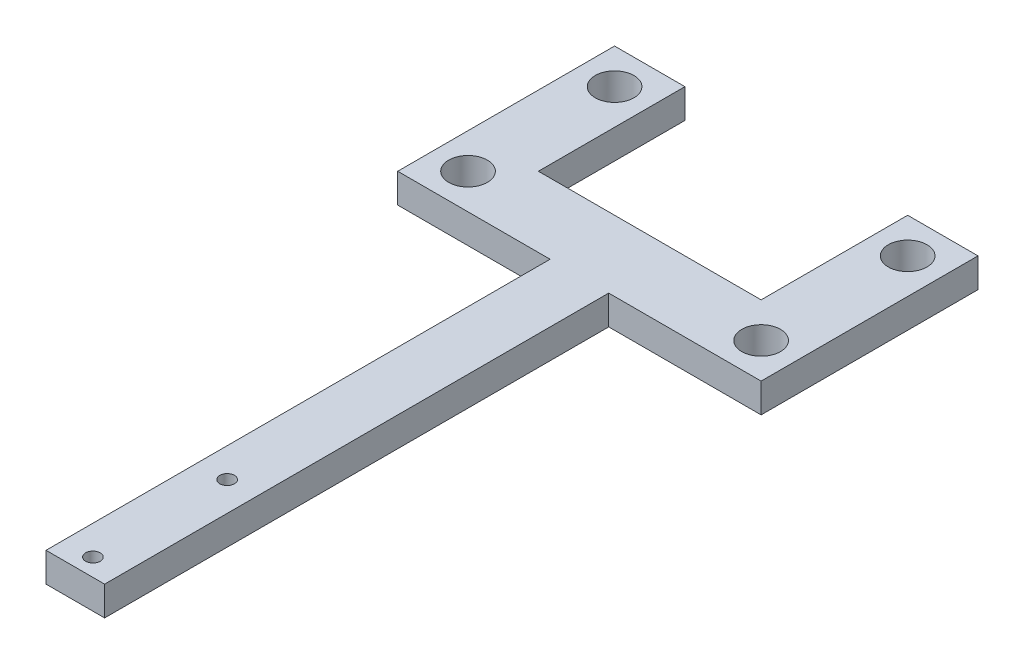
ISO-10303-21;
HEADER;
FILE_DESCRIPTION(('STEP AP214'),'2;1');
FILE_NAME('part.step','',(''),(''),'','','');
FILE_SCHEMA(('AUTOMOTIVE_DESIGN { 1 0 10303 214 1 1 1 1 }'));
ENDSEC;
DATA;
#1=APPLICATION_CONTEXT('core data for automotive mechanical design processes');
#2=APPLICATION_PROTOCOL_DEFINITION('international standard','automotive_design',2000,#1);
#3=PRODUCT_CONTEXT('',#1,'mechanical');
#4=PRODUCT('Part','Part','',(#3));
#5=PRODUCT_RELATED_PRODUCT_CATEGORY('part','',(#4));
#6=PRODUCT_DEFINITION_FORMATION('','',#4);
#7=PRODUCT_DEFINITION_CONTEXT('part definition',#1,'design');
#8=PRODUCT_DEFINITION('design','',#6,#7);
#9=PRODUCT_DEFINITION_SHAPE('','',#8);
#10=(LENGTH_UNIT() NAMED_UNIT(*) SI_UNIT(.MILLI.,.METRE.));
#11=(NAMED_UNIT(*) PLANE_ANGLE_UNIT() SI_UNIT($,.RADIAN.));
#12=(NAMED_UNIT(*) SI_UNIT($,.STERADIAN.) SOLID_ANGLE_UNIT());
#13=UNCERTAINTY_MEASURE_WITH_UNIT(LENGTH_MEASURE(1.E-05),#10,'distance_accuracy_value','');
#14=(GEOMETRIC_REPRESENTATION_CONTEXT(3) GLOBAL_UNCERTAINTY_ASSIGNED_CONTEXT((#13)) GLOBAL_UNIT_ASSIGNED_CONTEXT((#10,
#11,#12)) REPRESENTATION_CONTEXT('',''));
#15=CARTESIAN_POINT('',(0.,0.,0.));
#16=DIRECTION('',(0.,0.,1.));
#17=DIRECTION('',(1.,0.,0.));
#18=AXIS2_PLACEMENT_3D('',#15,#16,#17);
#19=CARTESIAN_POINT('',(-31.,5.,61.5));
#20=DIRECTION('',(0.,0.,-1.));
#21=DIRECTION('',(-1.,0.,0.));
#22=AXIS2_PLACEMENT_3D('',#19,#20,#21);
#23=PLANE('',#22);
#24=DIRECTION('',(1.,0.,0.));
#25=VECTOR('',#24,1.);
#26=CARTESIAN_POINT('',(-31.,0.,61.5));
#27=LINE('',#26,#25);
#28=CARTESIAN_POINT('',(-5.00000000000001,0.,61.5));
#29=VERTEX_POINT('',#28);
#30=CARTESIAN_POINT('',(4.99999999999999,0.,61.5));
#31=VERTEX_POINT('',#30);
#32=EDGE_CURVE('E189',#29,#31,#27,.T.);
#33=ORIENTED_EDGE('',*,*,#32,.T.);
#34=DIRECTION('',(0.,-1.,0.));
#35=VECTOR('',#34,1.);
#36=CARTESIAN_POINT('',(4.99999999999999,0.,61.5));
#37=LINE('',#36,#35);
#38=CARTESIAN_POINT('',(4.99999999999999,5.,61.5));
#39=VERTEX_POINT('',#38);
#40=EDGE_CURVE('E48',#39,#31,#37,.T.);
#41=ORIENTED_EDGE('',*,*,#40,.F.);
#42=DIRECTION('',(1.,0.,0.));
#43=VECTOR('',#42,1.);
#44=CARTESIAN_POINT('',(-31.,5.,61.5));
#45=LINE('',#44,#43);
#46=CARTESIAN_POINT('',(-5.00000000000001,5.,61.5));
#47=VERTEX_POINT('',#46);
#48=EDGE_CURVE('E196',#47,#39,#45,.T.);
#49=ORIENTED_EDGE('',*,*,#48,.F.);
#50=DIRECTION('',(0.,1.,0.));
#51=VECTOR('',#50,1.);
#52=CARTESIAN_POINT('',(-5.00000000000001,0.,61.5));
#53=LINE('',#52,#51);
#54=EDGE_CURVE('E148',#29,#47,#53,.T.);
#55=ORIENTED_EDGE('',*,*,#54,.F.);
#56=EDGE_LOOP('',(#33,#41,#49,#55));
#57=FACE_BOUND('',#56,.T.);
#58=ADVANCED_FACE('F31',(#57),#23,.F.);
#59=CARTESIAN_POINT('',(-31.,5.,-61.5));
#60=DIRECTION('',(0.,0.,1.));
#61=DIRECTION('',(1.,0.,0.));
#62=AXIS2_PLACEMENT_3D('',#59,#60,#61);
#63=PLANE('',#62);
#64=DIRECTION('',(-1.,0.,0.));
#65=VECTOR('',#64,1.);
#66=CARTESIAN_POINT('',(-31.,0.,-61.5));
#67=LINE('',#66,#65);
#68=CARTESIAN_POINT('',(31.,0.,-61.5));
#69=VERTEX_POINT('',#68);
#70=CARTESIAN_POINT('',(19.,0.,-61.5));
#71=VERTEX_POINT('',#70);
#72=EDGE_CURVE('E201',#69,#71,#67,.T.);
#73=ORIENTED_EDGE('',*,*,#72,.T.);
#74=DIRECTION('',(0.,-1.,0.));
#75=VECTOR('',#74,1.);
#76=CARTESIAN_POINT('',(19.,5.,-61.5));
#77=LINE('',#76,#75);
#78=CARTESIAN_POINT('',(19.,5.,-61.5));
#79=VERTEX_POINT('',#78);
#80=EDGE_CURVE('E160',#79,#71,#77,.T.);
#81=ORIENTED_EDGE('',*,*,#80,.F.);
#82=DIRECTION('',(-1.,0.,0.));
#83=VECTOR('',#82,1.);
#84=CARTESIAN_POINT('',(-31.,5.,-61.5));
#85=LINE('',#84,#83);
#86=CARTESIAN_POINT('',(31.,5.,-61.5));
#87=VERTEX_POINT('',#86);
#88=EDGE_CURVE('E190',#87,#79,#85,.T.);
#89=ORIENTED_EDGE('',*,*,#88,.F.);
#90=DIRECTION('',(0.,-1.,0.));
#91=VECTOR('',#90,1.);
#92=CARTESIAN_POINT('',(31.,5.,-61.5));
#93=LINE('',#92,#91);
#94=EDGE_CURVE('E11',#87,#69,#93,.T.);
#95=ORIENTED_EDGE('',*,*,#94,.T.);
#96=EDGE_LOOP('',(#73,#81,#89,#95));
#97=FACE_BOUND('',#96,.T.);
#98=ADVANCED_FACE('F243',(#97),#63,.F.);
#99=CARTESIAN_POINT('',(31.,5.,61.5));
#100=DIRECTION('',(-1.,0.,0.));
#101=DIRECTION('',(0.,0.,1.));
#102=AXIS2_PLACEMENT_3D('',#99,#100,#101);
#103=PLANE('',#102);
#104=DIRECTION('',(0.,0.,-1.));
#105=VECTOR('',#104,1.);
#106=CARTESIAN_POINT('',(31.,5.,61.5));
#107=LINE('',#106,#105);
#108=CARTESIAN_POINT('',(31.,5.,-24.5));
#109=VERTEX_POINT('',#108);
#110=EDGE_CURVE('E186',#109,#87,#107,.T.);
#111=ORIENTED_EDGE('',*,*,#110,.F.);
#112=DIRECTION('',(0.,1.,0.));
#113=VECTOR('',#112,1.);
#114=CARTESIAN_POINT('',(31.,0.,-24.5));
#115=LINE('',#114,#113);
#116=CARTESIAN_POINT('',(31.,0.,-24.5));
#117=VERTEX_POINT('',#116);
#118=EDGE_CURVE('E213',#117,#109,#115,.T.);
#119=ORIENTED_EDGE('',*,*,#118,.F.);
#120=DIRECTION('',(0.,0.,-1.));
#121=VECTOR('',#120,1.);
#122=CARTESIAN_POINT('',(31.,0.,61.5));
#123=LINE('',#122,#121);
#124=EDGE_CURVE('E141',#117,#69,#123,.T.);
#125=ORIENTED_EDGE('',*,*,#124,.T.);
#126=ORIENTED_EDGE('',*,*,#94,.F.);
#127=EDGE_LOOP('',(#111,#119,#125,#126));
#128=FACE_BOUND('',#127,.T.);
#129=ADVANCED_FACE('F33',(#128),#103,.F.);
#130=CARTESIAN_POINT('',(-19.,5.,-61.5));
#131=VERTEX_POINT('',#130);
#132=CARTESIAN_POINT('',(-31.,5.,-61.5));
#133=VERTEX_POINT('',#132);
#134=EDGE_CURVE('E188',#131,#133,#85,.T.);
#135=ORIENTED_EDGE('',*,*,#134,.F.);
#136=DIRECTION('',(0.,1.,0.));
#137=VECTOR('',#136,1.);
#138=CARTESIAN_POINT('',(-19.,5.,-61.5));
#139=LINE('',#138,#137);
#140=CARTESIAN_POINT('',(-19.,0.,-61.5));
#141=VERTEX_POINT('',#140);
#142=EDGE_CURVE('E165',#141,#131,#139,.T.);
#143=ORIENTED_EDGE('',*,*,#142,.F.);
#144=CARTESIAN_POINT('',(-31.,0.,-61.5));
#145=VERTEX_POINT('',#144);
#146=EDGE_CURVE('E200',#141,#145,#67,.T.);
#147=ORIENTED_EDGE('',*,*,#146,.T.);
#148=DIRECTION('',(0.,-1.,0.));
#149=VECTOR('',#148,1.);
#150=CARTESIAN_POINT('',(-31.,5.,-61.5));
#151=LINE('',#150,#149);
#152=EDGE_CURVE('E40',#133,#145,#151,.T.);
#153=ORIENTED_EDGE('',*,*,#152,.F.);
#154=EDGE_LOOP('',(#135,#143,#147,#153));
#155=FACE_BOUND('',#154,.T.);
#156=ADVANCED_FACE('F260',(#155),#63,.F.);
#157=CARTESIAN_POINT('',(-31.,5.,61.5));
#158=DIRECTION('',(1.,0.,0.));
#159=DIRECTION('',(0.,0.,-1.));
#160=AXIS2_PLACEMENT_3D('',#157,#158,#159);
#161=PLANE('',#160);
#162=DIRECTION('',(0.,0.,1.));
#163=VECTOR('',#162,1.);
#164=CARTESIAN_POINT('',(-31.,0.,61.5));
#165=LINE('',#164,#163);
#166=CARTESIAN_POINT('',(-31.,0.,-24.5));
#167=VERTEX_POINT('',#166);
#168=EDGE_CURVE('E204',#145,#167,#165,.T.);
#169=ORIENTED_EDGE('',*,*,#168,.T.);
#170=DIRECTION('',(0.,-1.,0.));
#171=VECTOR('',#170,1.);
#172=CARTESIAN_POINT('',(-31.,0.,-24.5));
#173=LINE('',#172,#171);
#174=CARTESIAN_POINT('',(-31.,5.,-24.5));
#175=VERTEX_POINT('',#174);
#176=EDGE_CURVE('E143',#175,#167,#173,.T.);
#177=ORIENTED_EDGE('',*,*,#176,.F.);
#178=DIRECTION('',(0.,0.,1.));
#179=VECTOR('',#178,1.);
#180=CARTESIAN_POINT('',(-31.,5.,61.5));
#181=LINE('',#180,#179);
#182=EDGE_CURVE('E193',#133,#175,#181,.T.);
#183=ORIENTED_EDGE('',*,*,#182,.F.);
#184=ORIENTED_EDGE('',*,*,#152,.T.);
#185=EDGE_LOOP('',(#169,#177,#183,#184));
#186=FACE_BOUND('',#185,.T.);
#187=ADVANCED_FACE('F266',(#186),#161,.F.);
#188=CARTESIAN_POINT('',(31.,5.,-61.5));
#189=DIRECTION('',(0.,-1.,0.));
#190=DIRECTION('',(0.,0.,-1.));
#191=AXIS2_PLACEMENT_3D('',#188,#189,#190);
#192=PLANE('',#191);
#193=CARTESIAN_POINT('',(0.,5.,35.6));
#194=DIRECTION('',(0.,1.,0.));
#195=DIRECTION('',(0.,0.,1.));
#196=AXIS2_PLACEMENT_3D('',#193,#194,#195);
#197=CIRCLE('',#196,1.24999999999999);
#198=CARTESIAN_POINT('',(0.,5.,36.85));
#199=VERTEX_POINT('',#198);
#200=EDGE_CURVE('E433',#199,#199,#197,.T.);
#201=ORIENTED_EDGE('',*,*,#200,.F.);
#202=EDGE_LOOP('',(#201));
#203=FACE_BOUND('',#202,.T.);
#204=CARTESIAN_POINT('',(0.,5.,58.5));
#205=DIRECTION('',(0.,1.,0.));
#206=DIRECTION('',(0.,0.,1.));
#207=AXIS2_PLACEMENT_3D('',#204,#205,#206);
#208=CIRCLE('',#207,1.24999999999999);
#209=CARTESIAN_POINT('',(0.,5.,59.75));
#210=VERTEX_POINT('',#209);
#211=EDGE_CURVE('E437',#210,#210,#208,.T.);
#212=ORIENTED_EDGE('',*,*,#211,.F.);
#213=EDGE_LOOP('',(#212));
#214=FACE_BOUND('',#213,.T.);
#215=CARTESIAN_POINT('',(25.,5.,-30.5));
#216=DIRECTION('',(0.,1.,0.));
#217=DIRECTION('',(0.,0.,1.));
#218=AXIS2_PLACEMENT_3D('',#215,#216,#217);
#219=CIRCLE('',#218,3.3);
#220=CARTESIAN_POINT('',(25.,5.,-27.2));
#221=VERTEX_POINT('',#220);
#222=EDGE_CURVE('E230',#221,#221,#219,.T.);
#223=ORIENTED_EDGE('',*,*,#222,.F.);
#224=EDGE_LOOP('',(#223));
#225=FACE_BOUND('',#224,.T.);
#226=CARTESIAN_POINT('',(-25.,5.,-30.5));
#227=DIRECTION('',(0.,1.,0.));
#228=DIRECTION('',(0.,0.,1.));
#229=AXIS2_PLACEMENT_3D('',#226,#227,#228);
#230=CIRCLE('',#229,3.3);
#231=CARTESIAN_POINT('',(-25.,5.,-27.2));
#232=VERTEX_POINT('',#231);
#233=EDGE_CURVE('E220',#232,#232,#230,.T.);
#234=ORIENTED_EDGE('',*,*,#233,.F.);
#235=EDGE_LOOP('',(#234));
#236=FACE_BOUND('',#235,.T.);
#237=CARTESIAN_POINT('',(25.,5.,-55.5));
#238=DIRECTION('',(0.,1.,0.));
#239=DIRECTION('',(0.,0.,1.));
#240=AXIS2_PLACEMENT_3D('',#237,#238,#239);
#241=CIRCLE('',#240,3.3);
#242=CARTESIAN_POINT('',(25.,5.,-52.2));
#243=VERTEX_POINT('',#242);
#244=EDGE_CURVE('E217',#243,#243,#241,.T.);
#245=ORIENTED_EDGE('',*,*,#244,.F.);
#246=EDGE_LOOP('',(#245));
#247=FACE_BOUND('',#246,.T.);
#248=CARTESIAN_POINT('',(-25.,5.,-55.5));
#249=DIRECTION('',(0.,1.,0.));
#250=DIRECTION('',(0.,0.,1.));
#251=AXIS2_PLACEMENT_3D('',#248,#249,#250);
#252=CIRCLE('',#251,3.3);
#253=CARTESIAN_POINT('',(-25.,5.,-52.2));
#254=VERTEX_POINT('',#253);
#255=EDGE_CURVE('E214',#254,#254,#252,.T.);
#256=ORIENTED_EDGE('',*,*,#255,.F.);
#257=EDGE_LOOP('',(#256));
#258=FACE_BOUND('',#257,.T.);
#259=DIRECTION('',(0.,0.,1.));
#260=VECTOR('',#259,1.);
#261=CARTESIAN_POINT('',(4.99999999999999,5.,61.5));
#262=LINE('',#261,#260);
#263=CARTESIAN_POINT('',(4.99999999999999,5.,-24.5));
#264=VERTEX_POINT('',#263);
#265=EDGE_CURVE('E130',#264,#39,#262,.T.);
#266=ORIENTED_EDGE('',*,*,#265,.F.);
#267=DIRECTION('',(1.,0.,0.));
#268=VECTOR('',#267,1.);
#269=CARTESIAN_POINT('',(4.99999999999999,5.,-24.5));
#270=LINE('',#269,#268);
#271=EDGE_CURVE('E128',#264,#109,#270,.T.);
#272=ORIENTED_EDGE('',*,*,#271,.T.);
#273=ORIENTED_EDGE('',*,*,#110,.T.);
#274=ORIENTED_EDGE('',*,*,#88,.T.);
#275=DIRECTION('',(0.,0.,-1.));
#276=VECTOR('',#275,1.);
#277=CARTESIAN_POINT('',(19.,5.,-36.5));
#278=LINE('',#277,#276);
#279=CARTESIAN_POINT('',(19.,5.,-36.5));
#280=VERTEX_POINT('',#279);
#281=EDGE_CURVE('E177',#280,#79,#278,.T.);
#282=ORIENTED_EDGE('',*,*,#281,.F.);
#283=DIRECTION('',(1.,0.,0.));
#284=VECTOR('',#283,1.);
#285=CARTESIAN_POINT('',(19.,5.,-36.5));
#286=LINE('',#285,#284);
#287=CARTESIAN_POINT('',(-19.,5.,-36.5));
#288=VERTEX_POINT('',#287);
#289=EDGE_CURVE('E171',#288,#280,#286,.T.);
#290=ORIENTED_EDGE('',*,*,#289,.F.);
#291=DIRECTION('',(0.,0.,-1.));
#292=VECTOR('',#291,1.);
#293=CARTESIAN_POINT('',(-19.,5.,-36.5));
#294=LINE('',#293,#292);
#295=EDGE_CURVE('E179',#288,#131,#294,.T.);
#296=ORIENTED_EDGE('',*,*,#295,.T.);
#297=ORIENTED_EDGE('',*,*,#134,.T.);
#298=ORIENTED_EDGE('',*,*,#182,.T.);
#299=DIRECTION('',(-1.,0.,0.));
#300=VECTOR('',#299,1.);
#301=CARTESIAN_POINT('',(-5.00000000000001,5.,-24.5));
#302=LINE('',#301,#300);
#303=CARTESIAN_POINT('',(-5.00000000000001,5.,-24.5));
#304=VERTEX_POINT('',#303);
#305=EDGE_CURVE('E155',#304,#175,#302,.T.);
#306=ORIENTED_EDGE('',*,*,#305,.F.);
#307=DIRECTION('',(0.,0.,-1.));
#308=VECTOR('',#307,1.);
#309=CARTESIAN_POINT('',(-5.00000000000001,5.,61.5));
#310=LINE('',#309,#308);
#311=EDGE_CURVE('E150',#47,#304,#310,.T.);
#312=ORIENTED_EDGE('',*,*,#311,.F.);
#313=ORIENTED_EDGE('',*,*,#48,.T.);
#314=EDGE_LOOP('',(#266,#272,#273,#274,#282,#290,#296,#297,#298,#306,#312,#313));
#315=FACE_BOUND('',#314,.T.);
#316=ADVANCED_FACE('F239',(#203,#214,#225,#236,#247,#258,#315),#192,.F.);
#317=CARTESIAN_POINT('',(31.,0.,-61.5));
#318=DIRECTION('',(0.,-1.,0.));
#319=DIRECTION('',(0.,0.,-1.));
#320=AXIS2_PLACEMENT_3D('',#317,#318,#319);
#321=PLANE('',#320);
#322=CARTESIAN_POINT('',(0.,0.,35.6));
#323=DIRECTION('',(0.,1.,0.));
#324=DIRECTION('',(0.,0.,1.));
#325=AXIS2_PLACEMENT_3D('',#322,#323,#324);
#326=CIRCLE('',#325,1.25);
#327=CARTESIAN_POINT('',(0.,0.,36.85));
#328=VERTEX_POINT('',#327);
#329=EDGE_CURVE('E452',#328,#328,#326,.T.);
#330=ORIENTED_EDGE('',*,*,#329,.T.);
#331=EDGE_LOOP('',(#330));
#332=FACE_BOUND('',#331,.T.);
#333=CARTESIAN_POINT('',(0.,0.,58.5));
#334=DIRECTION('',(0.,1.,0.));
#335=DIRECTION('',(0.,0.,1.));
#336=AXIS2_PLACEMENT_3D('',#333,#334,#335);
#337=CIRCLE('',#336,1.25);
#338=CARTESIAN_POINT('',(0.,0.,59.75));
#339=VERTEX_POINT('',#338);
#340=EDGE_CURVE('E448',#339,#339,#337,.T.);
#341=ORIENTED_EDGE('',*,*,#340,.T.);
#342=EDGE_LOOP('',(#341));
#343=FACE_BOUND('',#342,.T.);
#344=CARTESIAN_POINT('',(25.,0.,-30.5));
#345=DIRECTION('',(0.,-1.,0.));
#346=DIRECTION('',(0.,0.,-1.));
#347=AXIS2_PLACEMENT_3D('',#344,#345,#346);
#348=CIRCLE('',#347,3.3);
#349=CARTESIAN_POINT('',(25.,0.,-33.8));
#350=VERTEX_POINT('',#349);
#351=EDGE_CURVE('E35',#350,#350,#348,.T.);
#352=ORIENTED_EDGE('',*,*,#351,.F.);
#353=EDGE_LOOP('',(#352));
#354=FACE_BOUND('',#353,.T.);
#355=CARTESIAN_POINT('',(-25.,0.,-30.5));
#356=DIRECTION('',(0.,-1.,0.));
#357=DIRECTION('',(0.,0.,-1.));
#358=AXIS2_PLACEMENT_3D('',#355,#356,#357);
#359=CIRCLE('',#358,3.3);
#360=CARTESIAN_POINT('',(-25.,0.,-33.8));
#361=VERTEX_POINT('',#360);
#362=EDGE_CURVE('E218',#361,#361,#359,.T.);
#363=ORIENTED_EDGE('',*,*,#362,.F.);
#364=EDGE_LOOP('',(#363));
#365=FACE_BOUND('',#364,.T.);
#366=CARTESIAN_POINT('',(25.,0.,-55.5));
#367=DIRECTION('',(0.,-1.,0.));
#368=DIRECTION('',(0.,0.,-1.));
#369=AXIS2_PLACEMENT_3D('',#366,#367,#368);
#370=CIRCLE('',#369,3.3);
#371=CARTESIAN_POINT('',(25.,0.,-58.8));
#372=VERTEX_POINT('',#371);
#373=EDGE_CURVE('E215',#372,#372,#370,.T.);
#374=ORIENTED_EDGE('',*,*,#373,.F.);
#375=EDGE_LOOP('',(#374));
#376=FACE_BOUND('',#375,.T.);
#377=CARTESIAN_POINT('',(-25.,0.,-55.5));
#378=DIRECTION('',(0.,-1.,0.));
#379=DIRECTION('',(0.,0.,-1.));
#380=AXIS2_PLACEMENT_3D('',#377,#378,#379);
#381=CIRCLE('',#380,3.3);
#382=CARTESIAN_POINT('',(-25.,0.,-58.8));
#383=VERTEX_POINT('',#382);
#384=EDGE_CURVE('E210',#383,#383,#381,.T.);
#385=ORIENTED_EDGE('',*,*,#384,.F.);
#386=EDGE_LOOP('',(#385));
#387=FACE_BOUND('',#386,.T.);
#388=DIRECTION('',(1.,0.,0.));
#389=VECTOR('',#388,1.);
#390=CARTESIAN_POINT('',(4.99999999999999,0.,-24.5));
#391=LINE('',#390,#389);
#392=CARTESIAN_POINT('',(4.99999999999999,0.,-24.5));
#393=VERTEX_POINT('',#392);
#394=EDGE_CURVE('E125',#393,#117,#391,.T.);
#395=ORIENTED_EDGE('',*,*,#394,.F.);
#396=DIRECTION('',(0.,0.,-1.));
#397=VECTOR('',#396,1.);
#398=CARTESIAN_POINT('',(4.99999999999999,0.,61.5));
#399=LINE('',#398,#397);
#400=EDGE_CURVE('E131',#31,#393,#399,.T.);
#401=ORIENTED_EDGE('',*,*,#400,.F.);
#402=ORIENTED_EDGE('',*,*,#32,.F.);
#403=DIRECTION('',(0.,0.,1.));
#404=VECTOR('',#403,1.);
#405=CARTESIAN_POINT('',(-5.00000000000001,0.,61.5));
#406=LINE('',#405,#404);
#407=CARTESIAN_POINT('',(-5.00000000000002,0.,-24.5));
#408=VERTEX_POINT('',#407);
#409=EDGE_CURVE('E153',#408,#29,#406,.T.);
#410=ORIENTED_EDGE('',*,*,#409,.F.);
#411=DIRECTION('',(-1.,0.,0.));
#412=VECTOR('',#411,1.);
#413=CARTESIAN_POINT('',(-5.00000000000001,0.,-24.5));
#414=LINE('',#413,#412);
#415=EDGE_CURVE('E157',#408,#167,#414,.T.);
#416=ORIENTED_EDGE('',*,*,#415,.T.);
#417=ORIENTED_EDGE('',*,*,#168,.F.);
#418=ORIENTED_EDGE('',*,*,#146,.F.);
#419=DIRECTION('',(0.,0.,-1.));
#420=VECTOR('',#419,1.);
#421=CARTESIAN_POINT('',(-19.,0.,-36.5));
#422=LINE('',#421,#420);
#423=CARTESIAN_POINT('',(-19.,0.,-36.5));
#424=VERTEX_POINT('',#423);
#425=EDGE_CURVE('E182',#424,#141,#422,.T.);
#426=ORIENTED_EDGE('',*,*,#425,.F.);
#427=DIRECTION('',(-1.,0.,0.));
#428=VECTOR('',#427,1.);
#429=CARTESIAN_POINT('',(19.,0.,-36.5));
#430=LINE('',#429,#428);
#431=CARTESIAN_POINT('',(19.,0.,-36.5));
#432=VERTEX_POINT('',#431);
#433=EDGE_CURVE('E164',#432,#424,#430,.T.);
#434=ORIENTED_EDGE('',*,*,#433,.F.);
#435=DIRECTION('',(0.,0.,-1.));
#436=VECTOR('',#435,1.);
#437=CARTESIAN_POINT('',(19.,0.,-36.5));
#438=LINE('',#437,#436);
#439=EDGE_CURVE('E174',#432,#71,#438,.T.);
#440=ORIENTED_EDGE('',*,*,#439,.T.);
#441=ORIENTED_EDGE('',*,*,#72,.F.);
#442=ORIENTED_EDGE('',*,*,#124,.F.);
#443=EDGE_LOOP('',(#395,#401,#402,#410,#416,#417,#418,#426,#434,#440,#441,#442));
#444=FACE_BOUND('',#443,.T.);
#445=ADVANCED_FACE('F139',(#332,#343,#354,#365,#376,#387,#444),#321,.T.);
#446=CARTESIAN_POINT('',(19.,5.,-36.5));
#447=DIRECTION('',(1.,0.,0.));
#448=DIRECTION('',(0.,0.,-1.));
#449=AXIS2_PLACEMENT_3D('',#446,#447,#448);
#450=PLANE('',#449);
#451=ORIENTED_EDGE('',*,*,#80,.T.);
#452=ORIENTED_EDGE('',*,*,#439,.F.);
#453=DIRECTION('',(0.,-1.,0.));
#454=VECTOR('',#453,1.);
#455=CARTESIAN_POINT('',(19.,5.,-36.5));
#456=LINE('',#455,#454);
#457=EDGE_CURVE('E162',#280,#432,#456,.T.);
#458=ORIENTED_EDGE('',*,*,#457,.F.);
#459=ORIENTED_EDGE('',*,*,#281,.T.);
#460=EDGE_LOOP('',(#451,#452,#458,#459));
#461=FACE_BOUND('',#460,.T.);
#462=ADVANCED_FACE('F248',(#461),#450,.F.);
#463=CARTESIAN_POINT('',(-19.,5.,-36.5));
#464=DIRECTION('',(-1.,0.,0.));
#465=DIRECTION('',(0.,-1.,0.));
#466=AXIS2_PLACEMENT_3D('',#463,#464,#465);
#467=PLANE('',#466);
#468=ORIENTED_EDGE('',*,*,#142,.T.);
#469=ORIENTED_EDGE('',*,*,#295,.F.);
#470=DIRECTION('',(0.,1.,0.));
#471=VECTOR('',#470,1.);
#472=CARTESIAN_POINT('',(-19.,5.,-36.5));
#473=LINE('',#472,#471);
#474=EDGE_CURVE('E168',#424,#288,#473,.T.);
#475=ORIENTED_EDGE('',*,*,#474,.F.);
#476=ORIENTED_EDGE('',*,*,#425,.T.);
#477=EDGE_LOOP('',(#468,#469,#475,#476));
#478=FACE_BOUND('',#477,.T.);
#479=ADVANCED_FACE('F255',(#478),#467,.F.);
#480=CARTESIAN_POINT('',(19.,0.,-36.5));
#481=DIRECTION('',(0.,0.,-1.));
#482=DIRECTION('',(-1.,0.,0.));
#483=AXIS2_PLACEMENT_3D('',#480,#481,#482);
#484=PLANE('',#483);
#485=ORIENTED_EDGE('',*,*,#457,.T.);
#486=ORIENTED_EDGE('',*,*,#433,.T.);
#487=ORIENTED_EDGE('',*,*,#474,.T.);
#488=ORIENTED_EDGE('',*,*,#289,.T.);
#489=EDGE_LOOP('',(#485,#486,#487,#488));
#490=FACE_BOUND('',#489,.T.);
#491=ADVANCED_FACE('F252',(#490),#484,.T.);
#492=CARTESIAN_POINT('',(-5.00000000000001,0.,-24.5));
#493=DIRECTION('',(0.,0.,-1.));
#494=DIRECTION('',(-1.,0.,0.));
#495=AXIS2_PLACEMENT_3D('',#492,#493,#494);
#496=PLANE('',#495);
#497=ORIENTED_EDGE('',*,*,#176,.T.);
#498=ORIENTED_EDGE('',*,*,#415,.F.);
#499=DIRECTION('',(0.,-1.,0.));
#500=VECTOR('',#499,1.);
#501=CARTESIAN_POINT('',(-5.00000000000001,0.,-24.5));
#502=LINE('',#501,#500);
#503=EDGE_CURVE('E56',#304,#408,#502,.T.);
#504=ORIENTED_EDGE('',*,*,#503,.F.);
#505=ORIENTED_EDGE('',*,*,#305,.T.);
#506=EDGE_LOOP('',(#497,#498,#504,#505));
#507=FACE_BOUND('',#506,.T.);
#508=ADVANCED_FACE('F271',(#507),#496,.F.);
#509=CARTESIAN_POINT('',(-5.00000000000001,5.,61.5));
#510=DIRECTION('',(-1.,0.,0.));
#511=DIRECTION('',(0.,0.,1.));
#512=AXIS2_PLACEMENT_3D('',#509,#510,#511);
#513=PLANE('',#512);
#514=ORIENTED_EDGE('',*,*,#54,.T.);
#515=ORIENTED_EDGE('',*,*,#311,.T.);
#516=ORIENTED_EDGE('',*,*,#503,.T.);
#517=ORIENTED_EDGE('',*,*,#409,.T.);
#518=EDGE_LOOP('',(#514,#515,#516,#517));
#519=FACE_BOUND('',#518,.T.);
#520=ADVANCED_FACE('F273',(#519),#513,.T.);
#521=CARTESIAN_POINT('',(4.99999999999999,0.,-24.5));
#522=DIRECTION('',(0.,0.,-1.));
#523=DIRECTION('',(-1.,0.,0.));
#524=AXIS2_PLACEMENT_3D('',#521,#522,#523);
#525=PLANE('',#524);
#526=ORIENTED_EDGE('',*,*,#118,.T.);
#527=ORIENTED_EDGE('',*,*,#271,.F.);
#528=DIRECTION('',(0.,1.,0.));
#529=VECTOR('',#528,1.);
#530=CARTESIAN_POINT('',(4.99999999999999,0.,-24.5));
#531=LINE('',#530,#529);
#532=EDGE_CURVE('E122',#393,#264,#531,.T.);
#533=ORIENTED_EDGE('',*,*,#532,.F.);
#534=ORIENTED_EDGE('',*,*,#394,.T.);
#535=EDGE_LOOP('',(#526,#527,#533,#534));
#536=FACE_BOUND('',#535,.T.);
#537=ADVANCED_FACE('F123',(#536),#525,.F.);
#538=CARTESIAN_POINT('',(4.99999999999999,5.,61.5));
#539=DIRECTION('',(-1.,0.,0.));
#540=DIRECTION('',(0.,0.,1.));
#541=AXIS2_PLACEMENT_3D('',#538,#539,#540);
#542=PLANE('',#541);
#543=ORIENTED_EDGE('',*,*,#40,.T.);
#544=ORIENTED_EDGE('',*,*,#400,.T.);
#545=ORIENTED_EDGE('',*,*,#532,.T.);
#546=ORIENTED_EDGE('',*,*,#265,.T.);
#547=EDGE_LOOP('',(#543,#544,#545,#546));
#548=FACE_BOUND('',#547,.T.);
#549=ADVANCED_FACE('F133',(#548),#542,.F.);
#550=CARTESIAN_POINT('',(-25.,5.,-55.5));
#551=DIRECTION('',(0.,1.,0.));
#552=DIRECTION('',(0.,0.,1.));
#553=AXIS2_PLACEMENT_3D('',#550,#551,#552);
#554=CYLINDRICAL_SURFACE('',#553,3.3);
#555=ORIENTED_EDGE('',*,*,#384,.T.);
#556=EDGE_LOOP('',(#555));
#557=FACE_BOUND('',#556,.T.);
#558=ORIENTED_EDGE('',*,*,#255,.T.);
#559=EDGE_LOOP('',(#558));
#560=FACE_BOUND('',#559,.T.);
#561=ADVANCED_FACE('F367',(#557,#560),#554,.F.);
#562=CARTESIAN_POINT('',(25.,5.,-55.5));
#563=DIRECTION('',(0.,1.,0.));
#564=DIRECTION('',(0.,0.,1.));
#565=AXIS2_PLACEMENT_3D('',#562,#563,#564);
#566=CYLINDRICAL_SURFACE('',#565,3.3);
#567=ORIENTED_EDGE('',*,*,#373,.T.);
#568=EDGE_LOOP('',(#567));
#569=FACE_BOUND('',#568,.T.);
#570=ORIENTED_EDGE('',*,*,#244,.T.);
#571=EDGE_LOOP('',(#570));
#572=FACE_BOUND('',#571,.T.);
#573=ADVANCED_FACE('F374',(#569,#572),#566,.F.);
#574=CARTESIAN_POINT('',(-25.,5.,-30.5));
#575=DIRECTION('',(0.,1.,0.));
#576=DIRECTION('',(0.,0.,1.));
#577=AXIS2_PLACEMENT_3D('',#574,#575,#576);
#578=CYLINDRICAL_SURFACE('',#577,3.3);
#579=ORIENTED_EDGE('',*,*,#362,.T.);
#580=EDGE_LOOP('',(#579));
#581=FACE_BOUND('',#580,.T.);
#582=ORIENTED_EDGE('',*,*,#233,.T.);
#583=EDGE_LOOP('',(#582));
#584=FACE_BOUND('',#583,.T.);
#585=ADVANCED_FACE('F382',(#581,#584),#578,.F.);
#586=CARTESIAN_POINT('',(25.,5.,-30.5));
#587=DIRECTION('',(0.,1.,0.));
#588=DIRECTION('',(0.,0.,1.));
#589=AXIS2_PLACEMENT_3D('',#586,#587,#588);
#590=CYLINDRICAL_SURFACE('',#589,3.3);
#591=ORIENTED_EDGE('',*,*,#351,.T.);
#592=EDGE_LOOP('',(#591));
#593=FACE_BOUND('',#592,.T.);
#594=ORIENTED_EDGE('',*,*,#222,.T.);
#595=EDGE_LOOP('',(#594));
#596=FACE_BOUND('',#595,.T.);
#597=ADVANCED_FACE('F390',(#593,#596),#590,.F.);
#598=CARTESIAN_POINT('',(0.,5.,58.5));
#599=DIRECTION('',(0.,1.,0.));
#600=DIRECTION('',(0.,0.,1.));
#601=AXIS2_PLACEMENT_3D('',#598,#599,#600);
#602=CYLINDRICAL_SURFACE('',#601,1.24999999999999);
#603=ORIENTED_EDGE('',*,*,#340,.F.);
#604=EDGE_LOOP('',(#603));
#605=FACE_BOUND('',#604,.T.);
#606=ORIENTED_EDGE('',*,*,#211,.T.);
#607=EDGE_LOOP('',(#606));
#608=FACE_BOUND('',#607,.T.);
#609=ADVANCED_FACE('F397',(#605,#608),#602,.F.);
#610=CARTESIAN_POINT('',(0.,5.,35.6));
#611=DIRECTION('',(0.,1.,0.));
#612=DIRECTION('',(0.,0.,1.));
#613=AXIS2_PLACEMENT_3D('',#610,#611,#612);
#614=CYLINDRICAL_SURFACE('',#613,1.24999999999999);
#615=ORIENTED_EDGE('',*,*,#329,.F.);
#616=EDGE_LOOP('',(#615));
#617=FACE_BOUND('',#616,.T.);
#618=ORIENTED_EDGE('',*,*,#200,.T.);
#619=EDGE_LOOP('',(#618));
#620=FACE_BOUND('',#619,.T.);
#621=ADVANCED_FACE('F405',(#617,#620),#614,.F.);
#622=CLOSED_SHELL('',(#58,#98,#129,#156,#187,#316,#445,#462,#479,#491,#508,#520,#537,#549,#561,
#573,#585,#597,#609,#621));
#623=MANIFOLD_SOLID_BREP('B2',#622);
#624=ADVANCED_BREP_SHAPE_REPRESENTATION('',(#18,#623),#14);
#625=SHAPE_DEFINITION_REPRESENTATION(#9,#624);
ENDSEC;
END-ISO-10303-21;
